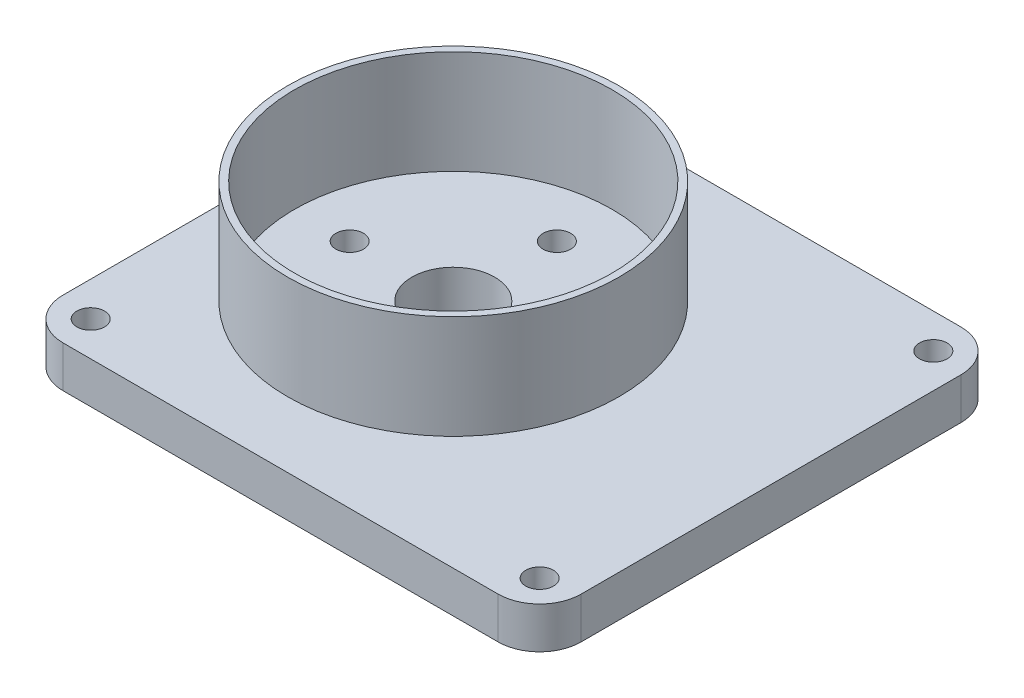
ISO-10303-21;
HEADER;
FILE_DESCRIPTION(('STEP AP214'),'2;1');
FILE_NAME('part.step','',(''),(''),'','','');
FILE_SCHEMA(('AUTOMOTIVE_DESIGN { 1 0 10303 214 1 1 1 1 }'));
ENDSEC;
DATA;
#1=APPLICATION_CONTEXT('core data for automotive mechanical design processes');
#2=APPLICATION_PROTOCOL_DEFINITION('international standard','automotive_design',2000,#1);
#3=PRODUCT_CONTEXT('',#1,'mechanical');
#4=PRODUCT('Part','Part','',(#3));
#5=PRODUCT_RELATED_PRODUCT_CATEGORY('part','',(#4));
#6=PRODUCT_DEFINITION_FORMATION('','',#4);
#7=PRODUCT_DEFINITION_CONTEXT('part definition',#1,'design');
#8=PRODUCT_DEFINITION('design','',#6,#7);
#9=PRODUCT_DEFINITION_SHAPE('','',#8);
#10=(LENGTH_UNIT() NAMED_UNIT(*) SI_UNIT(.MILLI.,.METRE.));
#11=(NAMED_UNIT(*) PLANE_ANGLE_UNIT() SI_UNIT($,.RADIAN.));
#12=(NAMED_UNIT(*) SI_UNIT($,.STERADIAN.) SOLID_ANGLE_UNIT());
#13=UNCERTAINTY_MEASURE_WITH_UNIT(LENGTH_MEASURE(1.E-05),#10,'distance_accuracy_value','');
#14=(GEOMETRIC_REPRESENTATION_CONTEXT(3) GLOBAL_UNCERTAINTY_ASSIGNED_CONTEXT((#13)) GLOBAL_UNIT_ASSIGNED_CONTEXT((#10,
#11,#12)) REPRESENTATION_CONTEXT('',''));
#15=CARTESIAN_POINT('',(0.,0.,0.));
#16=DIRECTION('',(0.,0.,1.));
#17=DIRECTION('',(1.,0.,0.));
#18=AXIS2_PLACEMENT_3D('',#15,#16,#17);
#19=CARTESIAN_POINT('',(0.,3.,0.));
#20=DIRECTION('',(0.,1.,0.));
#21=DIRECTION('',(0.,0.,1.));
#22=AXIS2_PLACEMENT_3D('',#19,#20,#21);
#23=PLANE('',#22);
#24=CARTESIAN_POINT('',(-4.25,3.,0.));
#25=DIRECTION('',(0.,1.,0.));
#26=DIRECTION('',(0.,0.,1.));
#27=AXIS2_PLACEMENT_3D('',#24,#25,#26);
#28=CIRCLE('',#27,3.);
#29=CARTESIAN_POINT('',(-4.25,3.,3.));
#30=VERTEX_POINT('',#29);
#31=EDGE_CURVE('E379',#30,#30,#28,.T.);
#32=ORIENTED_EDGE('',*,*,#31,.F.);
#33=EDGE_LOOP('',(#32));
#34=FACE_BOUND('',#33,.T.);
#35=CARTESIAN_POINT('',(-4.25000000000007,3.,7.5));
#36=DIRECTION('',(0.,1.,0.));
#37=DIRECTION('',(0.,0.,1.));
#38=AXIS2_PLACEMENT_3D('',#35,#36,#37);
#39=CIRCLE('',#38,1.);
#40=CARTESIAN_POINT('',(-4.25000000000007,3.,8.5));
#41=VERTEX_POINT('',#40);
#42=EDGE_CURVE('E367',#41,#41,#39,.T.);
#43=ORIENTED_EDGE('',*,*,#42,.F.);
#44=EDGE_LOOP('',(#43));
#45=FACE_BOUND('',#44,.T.);
#46=CARTESIAN_POINT('',(-4.24999999999998,3.,-7.5));
#47=DIRECTION('',(0.,1.,0.));
#48=DIRECTION('',(0.,0.,1.));
#49=AXIS2_PLACEMENT_3D('',#46,#47,#48);
#50=CIRCLE('',#49,1.);
#51=CARTESIAN_POINT('',(-4.24999999999998,3.,-6.5));
#52=VERTEX_POINT('',#51);
#53=EDGE_CURVE('E355',#52,#52,#50,.T.);
#54=ORIENTED_EDGE('',*,*,#53,.F.);
#55=EDGE_LOOP('',(#54));
#56=FACE_BOUND('',#55,.T.);
#57=CARTESIAN_POINT('',(-11.75,3.,0.));
#58=DIRECTION('',(0.,1.,0.));
#59=DIRECTION('',(0.,0.,1.));
#60=AXIS2_PLACEMENT_3D('',#57,#58,#59);
#61=CIRCLE('',#60,1.);
#62=CARTESIAN_POINT('',(-11.75,3.,1.));
#63=VERTEX_POINT('',#62);
#64=EDGE_CURVE('E361',#63,#63,#61,.T.);
#65=ORIENTED_EDGE('',*,*,#64,.F.);
#66=EDGE_LOOP('',(#65));
#67=FACE_BOUND('',#66,.T.);
#68=CARTESIAN_POINT('',(3.25,3.,0.));
#69=DIRECTION('',(0.,1.,0.));
#70=DIRECTION('',(0.,0.,1.));
#71=AXIS2_PLACEMENT_3D('',#68,#69,#70);
#72=CIRCLE('',#71,0.999999999999999);
#73=CARTESIAN_POINT('',(3.25,3.,1.00000000000005));
#74=VERTEX_POINT('',#73);
#75=EDGE_CURVE('E373',#74,#74,#72,.T.);
#76=ORIENTED_EDGE('',*,*,#75,.F.);
#77=EDGE_LOOP('',(#76));
#78=FACE_BOUND('',#77,.T.);
#79=CARTESIAN_POINT('',(-4.25,3.,0.));
#80=DIRECTION('',(0.,1.,0.));
#81=DIRECTION('',(0.,0.,1.));
#82=AXIS2_PLACEMENT_3D('',#79,#80,#81);
#83=CIRCLE('',#82,11.5);
#84=CARTESIAN_POINT('',(-4.25,3.,-11.5));
#85=VERTEX_POINT('',#84);
#86=EDGE_CURVE('E292',#85,#85,#83,.F.);
#87=ORIENTED_EDGE('',*,*,#86,.F.);
#88=EDGE_LOOP('',(#87));
#89=FACE_BOUND('',#88,.T.);
#90=ADVANCED_FACE('F187',(#34,#45,#56,#67,#78,#89),#23,.T.);
#91=CARTESIAN_POINT('',(-4.25,3.,0.));
#92=DIRECTION('',(0.,1.,0.));
#93=DIRECTION('',(0.,0.,1.));
#94=AXIS2_PLACEMENT_3D('',#91,#92,#93);
#95=CIRCLE('',#94,12.);
#96=CARTESIAN_POINT('',(-4.25,3.,-12.));
#97=VERTEX_POINT('',#96);
#98=EDGE_CURVE('E385',#97,#97,#95,.F.);
#99=ORIENTED_EDGE('',*,*,#98,.T.);
#100=EDGE_LOOP('',(#99));
#101=FACE_BOUND('',#100,.T.);
#102=CARTESIAN_POINT('',(-16.25,3.,-14.25));
#103=DIRECTION('',(0.,1.,0.));
#104=DIRECTION('',(0.,0.,1.));
#105=AXIS2_PLACEMENT_3D('',#102,#103,#104);
#106=CIRCLE('',#105,1.);
#107=CARTESIAN_POINT('',(-16.25,3.,-13.25));
#108=VERTEX_POINT('',#107);
#109=EDGE_CURVE('E349',#108,#108,#106,.T.);
#110=ORIENTED_EDGE('',*,*,#109,.F.);
#111=EDGE_LOOP('',(#110));
#112=FACE_BOUND('',#111,.T.);
#113=CARTESIAN_POINT('',(16.2500000000001,3.,-14.2499999999999));
#114=DIRECTION('',(0.,-1.,0.));
#115=DIRECTION('',(0.,0.,-1.));
#116=AXIS2_PLACEMENT_3D('',#113,#114,#115);
#117=CIRCLE('',#116,1.);
#118=CARTESIAN_POINT('',(16.2500000000001,3.,-15.2499999999999));
#119=VERTEX_POINT('',#118);
#120=EDGE_CURVE('E343',#119,#119,#117,.T.);
#121=ORIENTED_EDGE('',*,*,#120,.T.);
#122=EDGE_LOOP('',(#121));
#123=FACE_BOUND('',#122,.T.);
#124=DIRECTION('',(0.,0.,1.));
#125=VECTOR('',#124,1.);
#126=CARTESIAN_POINT('',(-18.75,3.,-16.75));
#127=LINE('',#126,#125);
#128=CARTESIAN_POINT('',(-18.75,3.,-13.75));
#129=VERTEX_POINT('',#128);
#130=CARTESIAN_POINT('',(-18.75,3.,13.75));
#131=VERTEX_POINT('',#130);
#132=EDGE_CURVE('E291',#129,#131,#127,.T.);
#133=ORIENTED_EDGE('',*,*,#132,.T.);
#134=CARTESIAN_POINT('',(-15.75,3.,13.75));
#135=DIRECTION('',(0.,1.,0.));
#136=DIRECTION('',(0.,0.,1.));
#137=AXIS2_PLACEMENT_3D('',#134,#135,#136);
#138=CIRCLE('',#137,3.);
#139=CARTESIAN_POINT('',(-15.75,3.,16.75));
#140=VERTEX_POINT('',#139);
#141=EDGE_CURVE('E306',#131,#140,#138,.T.);
#142=ORIENTED_EDGE('',*,*,#141,.T.);
#143=DIRECTION('',(1.,0.,0.));
#144=VECTOR('',#143,1.);
#145=CARTESIAN_POINT('',(-18.75,3.,16.75));
#146=LINE('',#145,#144);
#147=CARTESIAN_POINT('',(15.75,3.,16.75));
#148=VERTEX_POINT('',#147);
#149=EDGE_CURVE('E273',#140,#148,#146,.T.);
#150=ORIENTED_EDGE('',*,*,#149,.T.);
#151=CARTESIAN_POINT('',(15.75,3.,13.75));
#152=DIRECTION('',(0.,1.,0.));
#153=DIRECTION('',(0.,0.,1.));
#154=AXIS2_PLACEMENT_3D('',#151,#152,#153);
#155=CIRCLE('',#154,3.);
#156=CARTESIAN_POINT('',(18.75,3.,13.75));
#157=VERTEX_POINT('',#156);
#158=EDGE_CURVE('E304',#148,#157,#155,.T.);
#159=ORIENTED_EDGE('',*,*,#158,.T.);
#160=DIRECTION('',(0.,0.,1.));
#161=VECTOR('',#160,1.);
#162=CARTESIAN_POINT('',(18.75,3.,-16.75));
#163=LINE('',#162,#161);
#164=CARTESIAN_POINT('',(18.75,3.,-13.75));
#165=VERTEX_POINT('',#164);
#166=EDGE_CURVE('E318',#165,#157,#163,.T.);
#167=ORIENTED_EDGE('',*,*,#166,.F.);
#168=CARTESIAN_POINT('',(15.75,3.,-13.75));
#169=DIRECTION('',(0.,1.,0.));
#170=DIRECTION('',(0.,0.,1.));
#171=AXIS2_PLACEMENT_3D('',#168,#169,#170);
#172=CIRCLE('',#171,3.);
#173=CARTESIAN_POINT('',(15.75,3.,-16.75));
#174=VERTEX_POINT('',#173);
#175=EDGE_CURVE('E202',#165,#174,#172,.T.);
#176=ORIENTED_EDGE('',*,*,#175,.T.);
#177=DIRECTION('',(1.,0.,0.));
#178=VECTOR('',#177,1.);
#179=CARTESIAN_POINT('',(-18.75,3.,-16.75));
#180=LINE('',#179,#178);
#181=CARTESIAN_POINT('',(-15.75,3.,-16.75));
#182=VERTEX_POINT('',#181);
#183=EDGE_CURVE('E325',#182,#174,#180,.T.);
#184=ORIENTED_EDGE('',*,*,#183,.F.);
#185=CARTESIAN_POINT('',(-15.75,3.,-13.75));
#186=DIRECTION('',(0.,1.,0.));
#187=DIRECTION('',(0.,0.,1.));
#188=AXIS2_PLACEMENT_3D('',#185,#186,#187);
#189=CIRCLE('',#188,3.);
#190=EDGE_CURVE('E301',#182,#129,#189,.T.);
#191=ORIENTED_EDGE('',*,*,#190,.T.);
#192=EDGE_LOOP('',(#133,#142,#150,#159,#167,#176,#184,#191));
#193=FACE_BOUND('',#192,.T.);
#194=CARTESIAN_POINT('',(-16.25,3.,14.25));
#195=DIRECTION('',(0.,-1.,0.));
#196=DIRECTION('',(0.,0.,-1.));
#197=AXIS2_PLACEMENT_3D('',#194,#195,#196);
#198=CIRCLE('',#197,1.);
#199=CARTESIAN_POINT('',(-16.25,3.,13.25));
#200=VERTEX_POINT('',#199);
#201=EDGE_CURVE('E285',#200,#200,#198,.T.);
#202=ORIENTED_EDGE('',*,*,#201,.T.);
#203=EDGE_LOOP('',(#202));
#204=FACE_BOUND('',#203,.T.);
#205=CARTESIAN_POINT('',(16.2499999999999,3.,14.2500000000001));
#206=DIRECTION('',(0.,1.,0.));
#207=DIRECTION('',(0.,0.,1.));
#208=AXIS2_PLACEMENT_3D('',#205,#206,#207);
#209=CIRCLE('',#208,1.);
#210=CARTESIAN_POINT('',(16.2499999999999,3.,15.2500000000001));
#211=VERTEX_POINT('',#210);
#212=EDGE_CURVE('E337',#211,#211,#209,.T.);
#213=ORIENTED_EDGE('',*,*,#212,.F.);
#214=EDGE_LOOP('',(#213));
#215=FACE_BOUND('',#214,.T.);
#216=ADVANCED_FACE('F416',(#101,#112,#123,#193,#204,#215),#23,.T.);
#217=CARTESIAN_POINT('',(0.,0.,0.));
#218=DIRECTION('',(0.,1.,0.));
#219=DIRECTION('',(0.,0.,1.));
#220=AXIS2_PLACEMENT_3D('',#217,#218,#219);
#221=PLANE('',#220);
#222=CARTESIAN_POINT('',(16.2500000000001,0.,-14.2499999999999));
#223=DIRECTION('',(0.,-1.,0.));
#224=DIRECTION('',(0.,0.,-1.));
#225=AXIS2_PLACEMENT_3D('',#222,#223,#224);
#226=CIRCLE('',#225,1.);
#227=CARTESIAN_POINT('',(16.2500000000001,0.,-15.2499999999999));
#228=VERTEX_POINT('',#227);
#229=EDGE_CURVE('E346',#228,#228,#226,.T.);
#230=ORIENTED_EDGE('',*,*,#229,.F.);
#231=EDGE_LOOP('',(#230));
#232=FACE_BOUND('',#231,.T.);
#233=CARTESIAN_POINT('',(-16.25,0.,14.25));
#234=DIRECTION('',(0.,-1.,0.));
#235=DIRECTION('',(0.,0.,-1.));
#236=AXIS2_PLACEMENT_3D('',#233,#234,#235);
#237=CIRCLE('',#236,1.);
#238=CARTESIAN_POINT('',(-16.25,0.,13.25));
#239=VERTEX_POINT('',#238);
#240=EDGE_CURVE('E334',#239,#239,#237,.T.);
#241=ORIENTED_EDGE('',*,*,#240,.F.);
#242=EDGE_LOOP('',(#241));
#243=FACE_BOUND('',#242,.T.);
#244=DIRECTION('',(1.,0.,0.));
#245=VECTOR('',#244,1.);
#246=CARTESIAN_POINT('',(-18.75,0.,16.75));
#247=LINE('',#246,#245);
#248=CARTESIAN_POINT('',(-15.75,0.,16.75));
#249=VERTEX_POINT('',#248);
#250=CARTESIAN_POINT('',(15.75,0.,16.75));
#251=VERTEX_POINT('',#250);
#252=EDGE_CURVE('E270',#249,#251,#247,.T.);
#253=ORIENTED_EDGE('',*,*,#252,.F.);
#254=CARTESIAN_POINT('',(-15.75,0.,13.75));
#255=DIRECTION('',(0.,1.,0.));
#256=DIRECTION('',(0.,0.,1.));
#257=AXIS2_PLACEMENT_3D('',#254,#255,#256);
#258=CIRCLE('',#257,3.);
#259=CARTESIAN_POINT('',(-18.75,0.,13.75));
#260=VERTEX_POINT('',#259);
#261=EDGE_CURVE('E253',#249,#260,#258,.F.);
#262=ORIENTED_EDGE('',*,*,#261,.T.);
#263=DIRECTION('',(0.,0.,1.));
#264=VECTOR('',#263,1.);
#265=CARTESIAN_POINT('',(-18.75,0.,-16.75));
#266=LINE('',#265,#264);
#267=CARTESIAN_POINT('',(-18.75,0.,-13.75));
#268=VERTEX_POINT('',#267);
#269=EDGE_CURVE('E281',#268,#260,#266,.T.);
#270=ORIENTED_EDGE('',*,*,#269,.F.);
#271=CARTESIAN_POINT('',(-15.75,0.,-13.75));
#272=DIRECTION('',(0.,1.,0.));
#273=DIRECTION('',(0.,0.,1.));
#274=AXIS2_PLACEMENT_3D('',#271,#272,#273);
#275=CIRCLE('',#274,3.);
#276=CARTESIAN_POINT('',(-15.75,0.,-16.75));
#277=VERTEX_POINT('',#276);
#278=EDGE_CURVE('E274',#268,#277,#275,.F.);
#279=ORIENTED_EDGE('',*,*,#278,.T.);
#280=DIRECTION('',(1.,0.,0.));
#281=VECTOR('',#280,1.);
#282=CARTESIAN_POINT('',(-18.75,0.,-16.75));
#283=LINE('',#282,#281);
#284=CARTESIAN_POINT('',(15.75,0.,-16.75));
#285=VERTEX_POINT('',#284);
#286=EDGE_CURVE('E283',#277,#285,#283,.T.);
#287=ORIENTED_EDGE('',*,*,#286,.T.);
#288=CARTESIAN_POINT('',(15.75,0.,-13.75));
#289=DIRECTION('',(0.,1.,0.));
#290=DIRECTION('',(0.,0.,1.));
#291=AXIS2_PLACEMENT_3D('',#288,#289,#290);
#292=CIRCLE('',#291,3.);
#293=CARTESIAN_POINT('',(18.75,0.,-13.75));
#294=VERTEX_POINT('',#293);
#295=EDGE_CURVE('E295',#285,#294,#292,.F.);
#296=ORIENTED_EDGE('',*,*,#295,.T.);
#297=DIRECTION('',(0.,0.,1.));
#298=VECTOR('',#297,1.);
#299=CARTESIAN_POINT('',(18.75,0.,-16.75));
#300=LINE('',#299,#298);
#301=CARTESIAN_POINT('',(18.75,0.,13.75));
#302=VERTEX_POINT('',#301);
#303=EDGE_CURVE('E280',#294,#302,#300,.T.);
#304=ORIENTED_EDGE('',*,*,#303,.T.);
#305=CARTESIAN_POINT('',(15.75,0.,13.75));
#306=DIRECTION('',(0.,1.,0.));
#307=DIRECTION('',(0.,0.,1.));
#308=AXIS2_PLACEMENT_3D('',#305,#306,#307);
#309=CIRCLE('',#308,3.);
#310=EDGE_CURVE('E264',#302,#251,#309,.F.);
#311=ORIENTED_EDGE('',*,*,#310,.T.);
#312=EDGE_LOOP('',(#253,#262,#270,#279,#287,#296,#304,#311));
#313=FACE_BOUND('',#312,.T.);
#314=CARTESIAN_POINT('',(16.2499999999999,0.,14.2500000000001));
#315=DIRECTION('',(0.,1.,0.));
#316=DIRECTION('',(0.,0.,1.));
#317=AXIS2_PLACEMENT_3D('',#314,#315,#316);
#318=CIRCLE('',#317,1.);
#319=CARTESIAN_POINT('',(16.2499999999999,0.,15.2500000000001));
#320=VERTEX_POINT('',#319);
#321=EDGE_CURVE('E340',#320,#320,#318,.T.);
#322=ORIENTED_EDGE('',*,*,#321,.T.);
#323=EDGE_LOOP('',(#322));
#324=FACE_BOUND('',#323,.T.);
#325=CARTESIAN_POINT('',(-16.25,0.,-14.25));
#326=DIRECTION('',(0.,1.,0.));
#327=DIRECTION('',(0.,0.,1.));
#328=AXIS2_PLACEMENT_3D('',#325,#326,#327);
#329=CIRCLE('',#328,1.);
#330=CARTESIAN_POINT('',(-16.25,0.,-13.25));
#331=VERTEX_POINT('',#330);
#332=EDGE_CURVE('E352',#331,#331,#329,.T.);
#333=ORIENTED_EDGE('',*,*,#332,.T.);
#334=EDGE_LOOP('',(#333));
#335=FACE_BOUND('',#334,.T.);
#336=CARTESIAN_POINT('',(-4.25,0.,0.));
#337=DIRECTION('',(0.,1.,0.));
#338=DIRECTION('',(0.,0.,1.));
#339=AXIS2_PLACEMENT_3D('',#336,#337,#338);
#340=CIRCLE('',#339,3.);
#341=CARTESIAN_POINT('',(-4.25,0.,3.));
#342=VERTEX_POINT('',#341);
#343=EDGE_CURVE('E382',#342,#342,#340,.T.);
#344=ORIENTED_EDGE('',*,*,#343,.T.);
#345=EDGE_LOOP('',(#344));
#346=FACE_BOUND('',#345,.T.);
#347=CARTESIAN_POINT('',(3.25,0.,0.));
#348=DIRECTION('',(0.,1.,0.));
#349=DIRECTION('',(0.,0.,1.));
#350=AXIS2_PLACEMENT_3D('',#347,#348,#349);
#351=CIRCLE('',#350,0.999999999999999);
#352=CARTESIAN_POINT('',(3.25,0.,1.00000000000005));
#353=VERTEX_POINT('',#352);
#354=EDGE_CURVE('E376',#353,#353,#351,.T.);
#355=ORIENTED_EDGE('',*,*,#354,.T.);
#356=EDGE_LOOP('',(#355));
#357=FACE_BOUND('',#356,.T.);
#358=CARTESIAN_POINT('',(-4.25000000000007,0.,7.5));
#359=DIRECTION('',(0.,1.,0.));
#360=DIRECTION('',(0.,0.,1.));
#361=AXIS2_PLACEMENT_3D('',#358,#359,#360);
#362=CIRCLE('',#361,1.);
#363=CARTESIAN_POINT('',(-4.25000000000007,0.,8.5));
#364=VERTEX_POINT('',#363);
#365=EDGE_CURVE('E370',#364,#364,#362,.T.);
#366=ORIENTED_EDGE('',*,*,#365,.T.);
#367=EDGE_LOOP('',(#366));
#368=FACE_BOUND('',#367,.T.);
#369=CARTESIAN_POINT('',(-11.75,0.,0.));
#370=DIRECTION('',(0.,1.,0.));
#371=DIRECTION('',(0.,0.,1.));
#372=AXIS2_PLACEMENT_3D('',#369,#370,#371);
#373=CIRCLE('',#372,1.);
#374=CARTESIAN_POINT('',(-11.75,0.,1.));
#375=VERTEX_POINT('',#374);
#376=EDGE_CURVE('E364',#375,#375,#373,.T.);
#377=ORIENTED_EDGE('',*,*,#376,.T.);
#378=EDGE_LOOP('',(#377));
#379=FACE_BOUND('',#378,.T.);
#380=CARTESIAN_POINT('',(-4.24999999999998,0.,-7.5));
#381=DIRECTION('',(0.,1.,0.));
#382=DIRECTION('',(0.,0.,1.));
#383=AXIS2_PLACEMENT_3D('',#380,#381,#382);
#384=CIRCLE('',#383,1.);
#385=CARTESIAN_POINT('',(-4.24999999999998,0.,-6.5));
#386=VERTEX_POINT('',#385);
#387=EDGE_CURVE('E358',#386,#386,#384,.T.);
#388=ORIENTED_EDGE('',*,*,#387,.T.);
#389=EDGE_LOOP('',(#388));
#390=FACE_BOUND('',#389,.T.);
#391=ADVANCED_FACE('F277',(#232,#243,#313,#324,#335,#346,#357,#368,#379,#390),#221,.F.);
#392=CARTESIAN_POINT('',(-18.75,3.,-16.75));
#393=DIRECTION('',(1.,0.,0.));
#394=DIRECTION('',(0.,0.,-1.));
#395=AXIS2_PLACEMENT_3D('',#392,#393,#394);
#396=PLANE('',#395);
#397=ORIENTED_EDGE('',*,*,#269,.T.);
#398=DIRECTION('',(0.,-1.,0.));
#399=VECTOR('',#398,1.);
#400=CARTESIAN_POINT('',(-18.75,3.,13.75));
#401=LINE('',#400,#399);
#402=EDGE_CURVE('E258',#260,#131,#401,.F.);
#403=ORIENTED_EDGE('',*,*,#402,.T.);
#404=ORIENTED_EDGE('',*,*,#132,.F.);
#405=DIRECTION('',(0.,-1.,0.));
#406=VECTOR('',#405,1.);
#407=CARTESIAN_POINT('',(-18.75,0.,-13.75));
#408=LINE('',#407,#406);
#409=EDGE_CURVE('E263',#129,#268,#408,.T.);
#410=ORIENTED_EDGE('',*,*,#409,.T.);
#411=EDGE_LOOP('',(#397,#403,#404,#410));
#412=FACE_BOUND('',#411,.T.);
#413=ADVANCED_FACE('F431',(#412),#396,.F.);
#414=CARTESIAN_POINT('',(-18.75,3.,16.75));
#415=DIRECTION('',(0.,0.,-1.));
#416=DIRECTION('',(-1.,0.,0.));
#417=AXIS2_PLACEMENT_3D('',#414,#415,#416);
#418=PLANE('',#417);
#419=ORIENTED_EDGE('',*,*,#149,.F.);
#420=DIRECTION('',(0.,-1.,0.));
#421=VECTOR('',#420,1.);
#422=CARTESIAN_POINT('',(-15.75,3.,16.75));
#423=LINE('',#422,#421);
#424=EDGE_CURVE('E257',#140,#249,#423,.T.);
#425=ORIENTED_EDGE('',*,*,#424,.T.);
#426=ORIENTED_EDGE('',*,*,#252,.T.);
#427=DIRECTION('',(0.,-1.,0.));
#428=VECTOR('',#427,1.);
#429=CARTESIAN_POINT('',(15.75,3.,16.75));
#430=LINE('',#429,#428);
#431=EDGE_CURVE('E275',#251,#148,#430,.F.);
#432=ORIENTED_EDGE('',*,*,#431,.T.);
#433=EDGE_LOOP('',(#419,#425,#426,#432));
#434=FACE_BOUND('',#433,.T.);
#435=ADVANCED_FACE('F269',(#434),#418,.F.);
#436=CARTESIAN_POINT('',(18.75,3.,-16.75));
#437=DIRECTION('',(1.,0.,0.));
#438=DIRECTION('',(0.,0.,-1.));
#439=AXIS2_PLACEMENT_3D('',#436,#437,#438);
#440=PLANE('',#439);
#441=ORIENTED_EDGE('',*,*,#166,.T.);
#442=DIRECTION('',(0.,-1.,0.));
#443=VECTOR('',#442,1.);
#444=CARTESIAN_POINT('',(18.75,0.,13.75));
#445=LINE('',#444,#443);
#446=EDGE_CURVE('E310',#157,#302,#445,.T.);
#447=ORIENTED_EDGE('',*,*,#446,.T.);
#448=ORIENTED_EDGE('',*,*,#303,.F.);
#449=DIRECTION('',(0.,-1.,0.));
#450=VECTOR('',#449,1.);
#451=CARTESIAN_POINT('',(18.75,3.,-13.75));
#452=LINE('',#451,#450);
#453=EDGE_CURVE('E308',#294,#165,#452,.F.);
#454=ORIENTED_EDGE('',*,*,#453,.T.);
#455=EDGE_LOOP('',(#441,#447,#448,#454));
#456=FACE_BOUND('',#455,.T.);
#457=ADVANCED_FACE('F316',(#456),#440,.T.);
#458=CARTESIAN_POINT('',(-18.75,3.,-16.75));
#459=DIRECTION('',(0.,0.,-1.));
#460=DIRECTION('',(-1.,0.,0.));
#461=AXIS2_PLACEMENT_3D('',#458,#459,#460);
#462=PLANE('',#461);
#463=ORIENTED_EDGE('',*,*,#183,.T.);
#464=DIRECTION('',(0.,-1.,0.));
#465=VECTOR('',#464,1.);
#466=CARTESIAN_POINT('',(15.75,3.,-16.75));
#467=LINE('',#466,#465);
#468=EDGE_CURVE('E14',#174,#285,#467,.T.);
#469=ORIENTED_EDGE('',*,*,#468,.T.);
#470=ORIENTED_EDGE('',*,*,#286,.F.);
#471=DIRECTION('',(0.,-1.,0.));
#472=VECTOR('',#471,1.);
#473=CARTESIAN_POINT('',(-15.75,3.,-16.75));
#474=LINE('',#473,#472);
#475=EDGE_CURVE('E195',#277,#182,#474,.F.);
#476=ORIENTED_EDGE('',*,*,#475,.T.);
#477=EDGE_LOOP('',(#463,#469,#470,#476));
#478=FACE_BOUND('',#477,.T.);
#479=ADVANCED_FACE('F324',(#478),#462,.T.);
#480=CARTESIAN_POINT('',(-16.25,3.,14.25));
#481=DIRECTION('',(0.,-1.,0.));
#482=DIRECTION('',(0.,0.,-1.));
#483=AXIS2_PLACEMENT_3D('',#480,#481,#482);
#484=CYLINDRICAL_SURFACE('',#483,1.);
#485=ORIENTED_EDGE('',*,*,#201,.F.);
#486=EDGE_LOOP('',(#485));
#487=FACE_BOUND('',#486,.T.);
#488=ORIENTED_EDGE('',*,*,#240,.T.);
#489=EDGE_LOOP('',(#488));
#490=FACE_BOUND('',#489,.T.);
#491=ADVANCED_FACE('F427',(#487,#490),#484,.F.);
#492=CARTESIAN_POINT('',(16.2499999999999,3.,14.2500000000001));
#493=DIRECTION('',(0.,-1.,0.));
#494=DIRECTION('',(0.,0.,-1.));
#495=AXIS2_PLACEMENT_3D('',#492,#493,#494);
#496=CYLINDRICAL_SURFACE('',#495,1.);
#497=ORIENTED_EDGE('',*,*,#212,.T.);
#498=EDGE_LOOP('',(#497));
#499=FACE_BOUND('',#498,.T.);
#500=ORIENTED_EDGE('',*,*,#321,.F.);
#501=EDGE_LOOP('',(#500));
#502=FACE_BOUND('',#501,.T.);
#503=ADVANCED_FACE('F460',(#499,#502),#496,.F.);
#504=CARTESIAN_POINT('',(16.2500000000001,3.,-14.2499999999999));
#505=DIRECTION('',(0.,-1.,0.));
#506=DIRECTION('',(0.,0.,-1.));
#507=AXIS2_PLACEMENT_3D('',#504,#505,#506);
#508=CYLINDRICAL_SURFACE('',#507,1.);
#509=ORIENTED_EDGE('',*,*,#120,.F.);
#510=EDGE_LOOP('',(#509));
#511=FACE_BOUND('',#510,.T.);
#512=ORIENTED_EDGE('',*,*,#229,.T.);
#513=EDGE_LOOP('',(#512));
#514=FACE_BOUND('',#513,.T.);
#515=ADVANCED_FACE('F463',(#511,#514),#508,.F.);
#516=CARTESIAN_POINT('',(-16.25,3.,-14.25));
#517=DIRECTION('',(0.,-1.,0.));
#518=DIRECTION('',(0.,0.,-1.));
#519=AXIS2_PLACEMENT_3D('',#516,#517,#518);
#520=CYLINDRICAL_SURFACE('',#519,1.);
#521=ORIENTED_EDGE('',*,*,#109,.T.);
#522=EDGE_LOOP('',(#521));
#523=FACE_BOUND('',#522,.T.);
#524=ORIENTED_EDGE('',*,*,#332,.F.);
#525=EDGE_LOOP('',(#524));
#526=FACE_BOUND('',#525,.T.);
#527=ADVANCED_FACE('F481',(#523,#526),#520,.F.);
#528=CARTESIAN_POINT('',(-4.24999999999998,3.,-7.5));
#529=DIRECTION('',(0.,-1.,0.));
#530=DIRECTION('',(0.,0.,-1.));
#531=AXIS2_PLACEMENT_3D('',#528,#529,#530);
#532=CYLINDRICAL_SURFACE('',#531,1.);
#533=ORIENTED_EDGE('',*,*,#53,.T.);
#534=EDGE_LOOP('',(#533));
#535=FACE_BOUND('',#534,.T.);
#536=ORIENTED_EDGE('',*,*,#387,.F.);
#537=EDGE_LOOP('',(#536));
#538=FACE_BOUND('',#537,.T.);
#539=ADVANCED_FACE('F478',(#535,#538),#532,.F.);
#540=CARTESIAN_POINT('',(-11.75,3.,0.));
#541=DIRECTION('',(0.,-1.,0.));
#542=DIRECTION('',(0.,0.,-1.));
#543=AXIS2_PLACEMENT_3D('',#540,#541,#542);
#544=CYLINDRICAL_SURFACE('',#543,1.);
#545=ORIENTED_EDGE('',*,*,#64,.T.);
#546=EDGE_LOOP('',(#545));
#547=FACE_BOUND('',#546,.T.);
#548=ORIENTED_EDGE('',*,*,#376,.F.);
#549=EDGE_LOOP('',(#548));
#550=FACE_BOUND('',#549,.T.);
#551=ADVANCED_FACE('F480',(#547,#550),#544,.F.);
#552=CARTESIAN_POINT('',(-4.25000000000007,3.,7.5));
#553=DIRECTION('',(0.,-1.,0.));
#554=DIRECTION('',(0.,0.,-1.));
#555=AXIS2_PLACEMENT_3D('',#552,#553,#554);
#556=CYLINDRICAL_SURFACE('',#555,1.);
#557=ORIENTED_EDGE('',*,*,#42,.T.);
#558=EDGE_LOOP('',(#557));
#559=FACE_BOUND('',#558,.T.);
#560=ORIENTED_EDGE('',*,*,#365,.F.);
#561=EDGE_LOOP('',(#560));
#562=FACE_BOUND('',#561,.T.);
#563=ADVANCED_FACE('F488',(#559,#562),#556,.F.);
#564=CARTESIAN_POINT('',(3.25,3.,0.));
#565=DIRECTION('',(0.,-1.,0.));
#566=DIRECTION('',(0.,0.,-1.));
#567=AXIS2_PLACEMENT_3D('',#564,#565,#566);
#568=CYLINDRICAL_SURFACE('',#567,0.999999999999999);
#569=ORIENTED_EDGE('',*,*,#75,.T.);
#570=EDGE_LOOP('',(#569));
#571=FACE_BOUND('',#570,.T.);
#572=ORIENTED_EDGE('',*,*,#354,.F.);
#573=EDGE_LOOP('',(#572));
#574=FACE_BOUND('',#573,.T.);
#575=ADVANCED_FACE('F411',(#571,#574),#568,.F.);
#576=CARTESIAN_POINT('',(-4.25,3.,0.));
#577=DIRECTION('',(0.,-1.,0.));
#578=DIRECTION('',(0.,0.,-1.));
#579=AXIS2_PLACEMENT_3D('',#576,#577,#578);
#580=CYLINDRICAL_SURFACE('',#579,3.);
#581=ORIENTED_EDGE('',*,*,#31,.T.);
#582=EDGE_LOOP('',(#581));
#583=FACE_BOUND('',#582,.T.);
#584=ORIENTED_EDGE('',*,*,#343,.F.);
#585=EDGE_LOOP('',(#584));
#586=FACE_BOUND('',#585,.T.);
#587=ADVANCED_FACE('F402',(#583,#586),#580,.F.);
#588=CARTESIAN_POINT('',(-4.25,10.5,0.));
#589=DIRECTION('',(0.,1.,0.));
#590=DIRECTION('',(0.,0.,1.));
#591=AXIS2_PLACEMENT_3D('',#588,#589,#590);
#592=PLANE('',#591);
#593=CARTESIAN_POINT('',(-4.25,10.5,0.));
#594=DIRECTION('',(0.,1.,0.));
#595=DIRECTION('',(0.,0.,1.));
#596=AXIS2_PLACEMENT_3D('',#593,#594,#595);
#597=CIRCLE('',#596,12.);
#598=CARTESIAN_POINT('',(-4.25,10.5,-12.));
#599=VERTEX_POINT('',#598);
#600=EDGE_CURVE('E389',#599,#599,#597,.T.);
#601=ORIENTED_EDGE('',*,*,#600,.T.);
#602=EDGE_LOOP('',(#601));
#603=FACE_BOUND('',#602,.T.);
#604=CARTESIAN_POINT('',(-4.25,10.5,0.));
#605=DIRECTION('',(0.,1.,0.));
#606=DIRECTION('',(0.,0.,1.));
#607=AXIS2_PLACEMENT_3D('',#604,#605,#606);
#608=CIRCLE('',#607,11.5);
#609=CARTESIAN_POINT('',(-4.25,10.5,-11.5));
#610=VERTEX_POINT('',#609);
#611=EDGE_CURVE('E393',#610,#610,#608,.T.);
#612=ORIENTED_EDGE('',*,*,#611,.F.);
#613=EDGE_LOOP('',(#612));
#614=FACE_BOUND('',#613,.T.);
#615=ADVANCED_FACE('F399',(#603,#614),#592,.T.);
#616=CARTESIAN_POINT('',(-4.25,10.5,0.));
#617=DIRECTION('',(0.,-1.,0.));
#618=DIRECTION('',(0.,0.,-1.));
#619=AXIS2_PLACEMENT_3D('',#616,#617,#618);
#620=CYLINDRICAL_SURFACE('',#619,12.);
#621=CARTESIAN_POINT('',(-4.25,3.,-12.));
#622=CARTESIAN_POINT('',(-4.25,3.078125,-12.));
#623=CARTESIAN_POINT('',(-4.25,3.15625,-12.));
#624=CARTESIAN_POINT('',(-4.25,3.3125,-12.));
#625=CARTESIAN_POINT('',(-4.25,3.390625,-12.));
#626=CARTESIAN_POINT('',(-4.25,3.546875,-12.));
#627=CARTESIAN_POINT('',(-4.25,3.625,-12.));
#628=CARTESIAN_POINT('',(-4.25,3.78125,-12.));
#629=CARTESIAN_POINT('',(-4.25,3.859375,-12.));
#630=CARTESIAN_POINT('',(-4.25,4.015625,-12.));
#631=CARTESIAN_POINT('',(-4.25,4.09375,-12.));
#632=CARTESIAN_POINT('',(-4.25,4.25,-12.));
#633=CARTESIAN_POINT('',(-4.25,4.328125,-12.));
#634=CARTESIAN_POINT('',(-4.25,4.484375,-12.));
#635=CARTESIAN_POINT('',(-4.25,4.5625,-12.));
#636=CARTESIAN_POINT('',(-4.25,4.71875,-12.));
#637=CARTESIAN_POINT('',(-4.25,4.796875,-12.));
#638=CARTESIAN_POINT('',(-4.25,4.953125,-12.));
#639=CARTESIAN_POINT('',(-4.25,5.03125,-12.));
#640=CARTESIAN_POINT('',(-4.25,5.1875,-12.));
#641=CARTESIAN_POINT('',(-4.25,5.265625,-12.));
#642=CARTESIAN_POINT('',(-4.25,5.421875,-12.));
#643=CARTESIAN_POINT('',(-4.25,5.5,-12.));
#644=CARTESIAN_POINT('',(-4.25,5.65625,-12.));
#645=CARTESIAN_POINT('',(-4.25,5.734375,-12.));
#646=CARTESIAN_POINT('',(-4.25,5.890625,-12.));
#647=CARTESIAN_POINT('',(-4.25,5.96875,-12.));
#648=CARTESIAN_POINT('',(-4.25,6.125,-12.));
#649=CARTESIAN_POINT('',(-4.25,6.203125,-12.));
#650=CARTESIAN_POINT('',(-4.25,6.359375,-12.));
#651=CARTESIAN_POINT('',(-4.25,6.4375,-12.));
#652=CARTESIAN_POINT('',(-4.25,6.59375,-12.));
#653=CARTESIAN_POINT('',(-4.25,6.671875,-12.));
#654=CARTESIAN_POINT('',(-4.25,6.828125,-12.));
#655=CARTESIAN_POINT('',(-4.25,6.90625,-12.));
#656=CARTESIAN_POINT('',(-4.25,7.0625,-12.));
#657=CARTESIAN_POINT('',(-4.25,7.140625,-12.));
#658=CARTESIAN_POINT('',(-4.25,7.296875,-12.));
#659=CARTESIAN_POINT('',(-4.25,7.375,-12.));
#660=CARTESIAN_POINT('',(-4.25,7.53125,-12.));
#661=CARTESIAN_POINT('',(-4.25,7.609375,-12.));
#662=CARTESIAN_POINT('',(-4.25,7.765625,-12.));
#663=CARTESIAN_POINT('',(-4.25,7.84375,-12.));
#664=CARTESIAN_POINT('',(-4.25,8.,-12.));
#665=CARTESIAN_POINT('',(-4.25,8.078125,-12.));
#666=CARTESIAN_POINT('',(-4.25,8.234375,-12.));
#667=CARTESIAN_POINT('',(-4.25,8.3125,-12.));
#668=CARTESIAN_POINT('',(-4.25,8.46875,-12.));
#669=CARTESIAN_POINT('',(-4.25,8.546875,-12.));
#670=CARTESIAN_POINT('',(-4.25,8.703125,-12.));
#671=CARTESIAN_POINT('',(-4.25,8.78125,-12.));
#672=CARTESIAN_POINT('',(-4.25,8.9375,-12.));
#673=CARTESIAN_POINT('',(-4.25,9.015625,-12.));
#674=CARTESIAN_POINT('',(-4.25,9.171875,-12.));
#675=CARTESIAN_POINT('',(-4.25,9.25,-12.));
#676=CARTESIAN_POINT('',(-4.25,9.40625,-12.));
#677=CARTESIAN_POINT('',(-4.25,9.484375,-12.));
#678=CARTESIAN_POINT('',(-4.25,9.640625,-12.));
#679=CARTESIAN_POINT('',(-4.25,9.71875,-12.));
#680=CARTESIAN_POINT('',(-4.25,9.875,-12.));
#681=CARTESIAN_POINT('',(-4.25,9.953125,-12.));
#682=CARTESIAN_POINT('',(-4.25,10.109375,-12.));
#683=CARTESIAN_POINT('',(-4.25,10.1875,-12.));
#684=CARTESIAN_POINT('',(-4.25,10.34375,-12.));
#685=CARTESIAN_POINT('',(-4.25,10.421875,-12.));
#686=CARTESIAN_POINT('',(-4.25,10.5,-12.));
#687=B_SPLINE_CURVE_WITH_KNOTS('',3,(#621,#622,#623,#624,#625,#626,#627,#628,#629,#630,#631,
#632,#633,#634,#635,#636,#637,#638,#639,#640,#641,#642,#643,#644,#645,#646,#647,#648,#649,#650,
#651,#652,#653,#654,#655,#656,#657,#658,#659,#660,#661,#662,#663,#664,#665,#666,#667,#668,#669,
#670,#671,#672,#673,#674,#675,#676,#677,#678,#679,#680,#681,#682,#683,#684,#685,#686),
.UNSPECIFIED.,.F.,.F.,(4,2,2,2,2,2,2,2,2,2,2,2,2,2,2,2,2,2,2,2,2,2,2,2,2,2,2,2,2,2,2,2,4),(0.,
0.234375,0.46875,0.703125000000001,0.937500000000001,1.171875,1.40625,1.640625,1.875,2.109375,
2.34375,2.578125,2.8125,3.046875,3.28125,3.515625,3.75,3.984375,4.21875,4.453125,4.6875,
4.921875,5.15625,5.390625,5.625,5.859375,6.09375,6.328125,6.5625,6.796875,7.03125,7.265625,7.5),.UNSPECIFIED.);
#688=EDGE_CURVE('BSEAM401',#97,#599,#687,.T.);
#689=ORIENTED_EDGE('',*,*,#98,.F.);
#690=ORIENTED_EDGE('',*,*,#600,.F.);
#691=ORIENTED_EDGE('',*,*,#688,.T.);
#692=ORIENTED_EDGE('',*,*,#688,.F.);
#693=EDGE_LOOP('',(#689,#691,#690,#692));
#694=FACE_BOUND('',#693,.T.);
#695=ADVANCED_FACE('F401',(#694),#620,.T.);
#696=CARTESIAN_POINT('',(-4.25,10.5,0.));
#697=DIRECTION('',(0.,-1.,0.));
#698=DIRECTION('',(0.,0.,-1.));
#699=AXIS2_PLACEMENT_3D('',#696,#697,#698);
#700=CYLINDRICAL_SURFACE('',#699,11.5);
#701=CARTESIAN_POINT('',(-4.25,3.,-11.5));
#702=CARTESIAN_POINT('',(-4.25,3.078125,-11.5));
#703=CARTESIAN_POINT('',(-4.25,3.15625,-11.5));
#704=CARTESIAN_POINT('',(-4.25,3.3125,-11.5));
#705=CARTESIAN_POINT('',(-4.25,3.390625,-11.5));
#706=CARTESIAN_POINT('',(-4.25,3.546875,-11.5));
#707=CARTESIAN_POINT('',(-4.25,3.625,-11.5));
#708=CARTESIAN_POINT('',(-4.25,3.78125,-11.5));
#709=CARTESIAN_POINT('',(-4.25,3.859375,-11.5));
#710=CARTESIAN_POINT('',(-4.25,4.015625,-11.5));
#711=CARTESIAN_POINT('',(-4.25,4.09375,-11.5));
#712=CARTESIAN_POINT('',(-4.25,4.25,-11.5));
#713=CARTESIAN_POINT('',(-4.25,4.328125,-11.5));
#714=CARTESIAN_POINT('',(-4.25,4.484375,-11.5));
#715=CARTESIAN_POINT('',(-4.25,4.5625,-11.5));
#716=CARTESIAN_POINT('',(-4.25,4.71875,-11.5));
#717=CARTESIAN_POINT('',(-4.25,4.796875,-11.5));
#718=CARTESIAN_POINT('',(-4.25,4.953125,-11.5));
#719=CARTESIAN_POINT('',(-4.25,5.03125,-11.5));
#720=CARTESIAN_POINT('',(-4.25,5.1875,-11.5));
#721=CARTESIAN_POINT('',(-4.25,5.265625,-11.5));
#722=CARTESIAN_POINT('',(-4.25,5.421875,-11.5));
#723=CARTESIAN_POINT('',(-4.25,5.5,-11.5));
#724=CARTESIAN_POINT('',(-4.25,5.65625,-11.5));
#725=CARTESIAN_POINT('',(-4.25,5.734375,-11.5));
#726=CARTESIAN_POINT('',(-4.25,5.890625,-11.5));
#727=CARTESIAN_POINT('',(-4.25,5.96875,-11.5));
#728=CARTESIAN_POINT('',(-4.25,6.125,-11.5));
#729=CARTESIAN_POINT('',(-4.25,6.203125,-11.5));
#730=CARTESIAN_POINT('',(-4.25,6.359375,-11.5));
#731=CARTESIAN_POINT('',(-4.25,6.4375,-11.5));
#732=CARTESIAN_POINT('',(-4.25,6.59375,-11.5));
#733=CARTESIAN_POINT('',(-4.25,6.671875,-11.5));
#734=CARTESIAN_POINT('',(-4.25,6.828125,-11.5));
#735=CARTESIAN_POINT('',(-4.25,6.90625,-11.5));
#736=CARTESIAN_POINT('',(-4.25,7.0625,-11.5));
#737=CARTESIAN_POINT('',(-4.25,7.140625,-11.5));
#738=CARTESIAN_POINT('',(-4.25,7.296875,-11.5));
#739=CARTESIAN_POINT('',(-4.25,7.375,-11.5));
#740=CARTESIAN_POINT('',(-4.25,7.53125,-11.5));
#741=CARTESIAN_POINT('',(-4.25,7.609375,-11.5));
#742=CARTESIAN_POINT('',(-4.25,7.765625,-11.5));
#743=CARTESIAN_POINT('',(-4.25,7.84375,-11.5));
#744=CARTESIAN_POINT('',(-4.25,8.,-11.5));
#745=CARTESIAN_POINT('',(-4.25,8.078125,-11.5));
#746=CARTESIAN_POINT('',(-4.25,8.234375,-11.5));
#747=CARTESIAN_POINT('',(-4.25,8.3125,-11.5));
#748=CARTESIAN_POINT('',(-4.25,8.46875,-11.5));
#749=CARTESIAN_POINT('',(-4.25,8.546875,-11.5));
#750=CARTESIAN_POINT('',(-4.25,8.703125,-11.5));
#751=CARTESIAN_POINT('',(-4.25,8.78125,-11.5));
#752=CARTESIAN_POINT('',(-4.25,8.9375,-11.5));
#753=CARTESIAN_POINT('',(-4.25,9.015625,-11.5));
#754=CARTESIAN_POINT('',(-4.25,9.171875,-11.5));
#755=CARTESIAN_POINT('',(-4.25,9.25,-11.5));
#756=CARTESIAN_POINT('',(-4.25,9.40625,-11.5));
#757=CARTESIAN_POINT('',(-4.25,9.484375,-11.5));
#758=CARTESIAN_POINT('',(-4.25,9.640625,-11.5));
#759=CARTESIAN_POINT('',(-4.25,9.71875,-11.5));
#760=CARTESIAN_POINT('',(-4.25,9.875,-11.5));
#761=CARTESIAN_POINT('',(-4.25,9.953125,-11.5));
#762=CARTESIAN_POINT('',(-4.25,10.109375,-11.5));
#763=CARTESIAN_POINT('',(-4.25,10.1875,-11.5));
#764=CARTESIAN_POINT('',(-4.25,10.34375,-11.5));
#765=CARTESIAN_POINT('',(-4.25,10.421875,-11.5));
#766=CARTESIAN_POINT('',(-4.25,10.5,-11.5));
#767=B_SPLINE_CURVE_WITH_KNOTS('',3,(#701,#702,#703,#704,#705,#706,#707,#708,#709,#710,#711,
#712,#713,#714,#715,#716,#717,#718,#719,#720,#721,#722,#723,#724,#725,#726,#727,#728,#729,#730,
#731,#732,#733,#734,#735,#736,#737,#738,#739,#740,#741,#742,#743,#744,#745,#746,#747,#748,#749,
#750,#751,#752,#753,#754,#755,#756,#757,#758,#759,#760,#761,#762,#763,#764,#765,#766),
.UNSPECIFIED.,.F.,.F.,(4,2,2,2,2,2,2,2,2,2,2,2,2,2,2,2,2,2,2,2,2,2,2,2,2,2,2,2,2,2,2,2,4),(0.,
0.234375,0.46875,0.703125000000001,0.937500000000001,1.171875,1.40625,1.640625,1.875,2.109375,
2.34375,2.578125,2.8125,3.046875,3.28125,3.515625,3.75,3.984375,4.21875,4.453125,4.6875,
4.921875,5.15625,5.390625,5.625,5.859375,6.09375,6.328125,6.5625,6.796875,7.03125,7.265625,7.5),.UNSPECIFIED.);
#768=EDGE_CURVE('BSEAM397',#85,#610,#767,.T.);
#769=ORIENTED_EDGE('',*,*,#86,.T.);
#770=ORIENTED_EDGE('',*,*,#611,.T.);
#771=ORIENTED_EDGE('',*,*,#768,.T.);
#772=ORIENTED_EDGE('',*,*,#768,.F.);
#773=EDGE_LOOP('',(#769,#771,#770,#772));
#774=FACE_BOUND('',#773,.T.);
#775=ADVANCED_FACE('F397',(#774),#700,.F.);
#776=CARTESIAN_POINT('',(-15.75,3.,13.75));
#777=DIRECTION('',(0.,-1.,0.));
#778=DIRECTION('',(0.,0.,-1.));
#779=AXIS2_PLACEMENT_3D('',#776,#777,#778);
#780=CYLINDRICAL_SURFACE('',#779,3.);
#781=ORIENTED_EDGE('',*,*,#141,.F.);
#782=ORIENTED_EDGE('',*,*,#402,.F.);
#783=ORIENTED_EDGE('',*,*,#261,.F.);
#784=ORIENTED_EDGE('',*,*,#424,.F.);
#785=EDGE_LOOP('',(#781,#782,#783,#784));
#786=FACE_BOUND('',#785,.T.);
#787=ADVANCED_FACE('F256',(#786),#780,.T.);
#788=CARTESIAN_POINT('',(15.75,3.,13.75));
#789=DIRECTION('',(0.,1.,0.));
#790=DIRECTION('',(0.,0.,1.));
#791=AXIS2_PLACEMENT_3D('',#788,#789,#790);
#792=CYLINDRICAL_SURFACE('',#791,3.);
#793=ORIENTED_EDGE('',*,*,#158,.F.);
#794=ORIENTED_EDGE('',*,*,#431,.F.);
#795=ORIENTED_EDGE('',*,*,#310,.F.);
#796=ORIENTED_EDGE('',*,*,#446,.F.);
#797=EDGE_LOOP('',(#793,#794,#795,#796));
#798=FACE_BOUND('',#797,.T.);
#799=ADVANCED_FACE('F444',(#798),#792,.T.);
#800=CARTESIAN_POINT('',(15.75,3.,-13.75));
#801=DIRECTION('',(0.,-1.,0.));
#802=DIRECTION('',(0.,0.,-1.));
#803=AXIS2_PLACEMENT_3D('',#800,#801,#802);
#804=CYLINDRICAL_SURFACE('',#803,3.);
#805=ORIENTED_EDGE('',*,*,#175,.F.);
#806=ORIENTED_EDGE('',*,*,#453,.F.);
#807=ORIENTED_EDGE('',*,*,#295,.F.);
#808=ORIENTED_EDGE('',*,*,#468,.F.);
#809=EDGE_LOOP('',(#805,#806,#807,#808));
#810=FACE_BOUND('',#809,.T.);
#811=ADVANCED_FACE('F323',(#810),#804,.T.);
#812=CARTESIAN_POINT('',(-15.75,3.,-13.75));
#813=DIRECTION('',(0.,1.,0.));
#814=DIRECTION('',(0.,0.,1.));
#815=AXIS2_PLACEMENT_3D('',#812,#813,#814);
#816=CYLINDRICAL_SURFACE('',#815,3.);
#817=ORIENTED_EDGE('',*,*,#190,.F.);
#818=ORIENTED_EDGE('',*,*,#475,.F.);
#819=ORIENTED_EDGE('',*,*,#278,.F.);
#820=ORIENTED_EDGE('',*,*,#409,.F.);
#821=EDGE_LOOP('',(#817,#818,#819,#820));
#822=FACE_BOUND('',#821,.T.);
#823=ADVANCED_FACE('F189',(#822),#816,.T.);
#824=CLOSED_SHELL('',(#90,#216,#391,#413,#435,#457,#479,#491,#503,#515,#527,#539,#551,#563,#575,
#587,#615,#695,#775,#787,#799,#811,#823));
#825=MANIFOLD_SOLID_BREP('B2',#824);
#826=ADVANCED_BREP_SHAPE_REPRESENTATION('',(#18,#825),#14);
#827=SHAPE_DEFINITION_REPRESENTATION(#9,#826);
ENDSEC;
END-ISO-10303-21;
